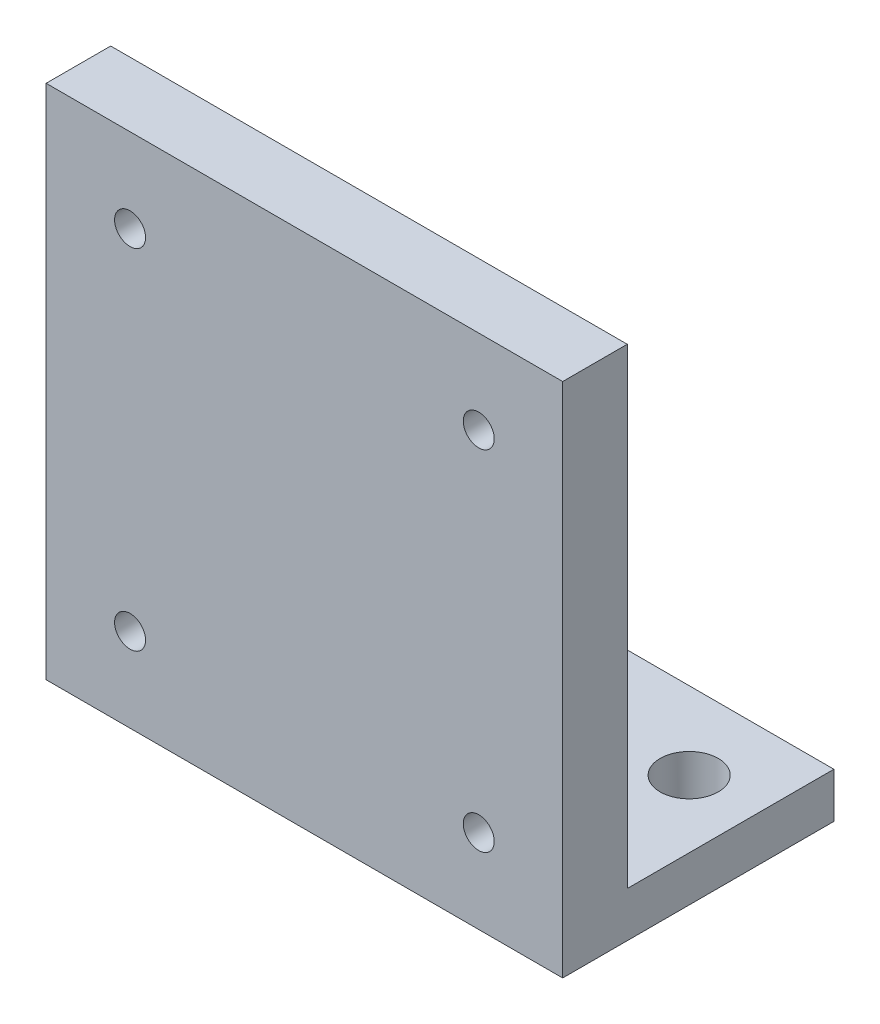
ISO-10303-21;
HEADER;
FILE_DESCRIPTION(('STEP AP214'),'2;1');
FILE_NAME('part.step','',(''),(''),'','','');
FILE_SCHEMA(('AUTOMOTIVE_DESIGN { 1 0 10303 214 1 1 1 1 }'));
ENDSEC;
DATA;
#1=APPLICATION_CONTEXT('core data for automotive mechanical design processes');
#2=APPLICATION_PROTOCOL_DEFINITION('international standard','automotive_design',2000,#1);
#3=PRODUCT_CONTEXT('',#1,'mechanical');
#4=PRODUCT('Part','Part','',(#3));
#5=PRODUCT_RELATED_PRODUCT_CATEGORY('part','',(#4));
#6=PRODUCT_DEFINITION_FORMATION('','',#4);
#7=PRODUCT_DEFINITION_CONTEXT('part definition',#1,'design');
#8=PRODUCT_DEFINITION('design','',#6,#7);
#9=PRODUCT_DEFINITION_SHAPE('','',#8);
#10=(LENGTH_UNIT() NAMED_UNIT(*) SI_UNIT(.MILLI.,.METRE.));
#11=(NAMED_UNIT(*) PLANE_ANGLE_UNIT() SI_UNIT($,.RADIAN.));
#12=(NAMED_UNIT(*) SI_UNIT($,.STERADIAN.) SOLID_ANGLE_UNIT());
#13=UNCERTAINTY_MEASURE_WITH_UNIT(LENGTH_MEASURE(1.E-05),#10,'distance_accuracy_value','');
#14=(GEOMETRIC_REPRESENTATION_CONTEXT(3) GLOBAL_UNCERTAINTY_ASSIGNED_CONTEXT((#13)) GLOBAL_UNIT_ASSIGNED_CONTEXT((#10,
#11,#12)) REPRESENTATION_CONTEXT('',''));
#15=CARTESIAN_POINT('',(0.,0.,0.));
#16=DIRECTION('',(0.,0.,1.));
#17=DIRECTION('',(1.,0.,0.));
#18=AXIS2_PLACEMENT_3D('',#15,#16,#17);
#19=CARTESIAN_POINT('',(0.,0.,0.));
#20=DIRECTION('',(0.,1.,0.));
#21=DIRECTION('',(0.,0.,1.));
#22=AXIS2_PLACEMENT_3D('',#19,#20,#21);
#23=PLANE('',#22);
#24=CARTESIAN_POINT('',(-14.7951397383474,0.,-14.));
#25=DIRECTION('',(0.,1.,0.));
#26=DIRECTION('',(0.,0.,1.));
#27=AXIS2_PLACEMENT_3D('',#24,#25,#26);
#28=CIRCLE('',#27,2.25);
#29=CARTESIAN_POINT('',(-14.7951397383474,0.,-11.75));
#30=VERTEX_POINT('',#29);
#31=EDGE_CURVE('E128',#30,#30,#28,.T.);
#32=ORIENTED_EDGE('',*,*,#31,.T.);
#33=EDGE_LOOP('',(#32));
#34=FACE_BOUND('',#33,.T.);
#35=CARTESIAN_POINT('',(14.7951397383474,0.,-14.));
#36=DIRECTION('',(0.,1.,0.));
#37=DIRECTION('',(0.,0.,1.));
#38=AXIS2_PLACEMENT_3D('',#35,#36,#37);
#39=CIRCLE('',#38,2.25);
#40=CARTESIAN_POINT('',(14.7951397383474,0.,-11.75));
#41=VERTEX_POINT('',#40);
#42=EDGE_CURVE('E125',#41,#41,#39,.T.);
#43=ORIENTED_EDGE('',*,*,#42,.T.);
#44=EDGE_LOOP('',(#43));
#45=FACE_BOUND('',#44,.T.);
#46=DIRECTION('',(0.,0.,-1.));
#47=VECTOR('',#46,1.);
#48=CARTESIAN_POINT('',(20.,0.,-20.));
#49=LINE('',#48,#47);
#50=CARTESIAN_POINT('',(20.,0.,1.));
#51=VERTEX_POINT('',#50);
#52=CARTESIAN_POINT('',(20.,0.,-20.));
#53=VERTEX_POINT('',#52);
#54=EDGE_CURVE('E142',#51,#53,#49,.T.);
#55=ORIENTED_EDGE('',*,*,#54,.F.);
#56=DIRECTION('',(-1.,0.,0.));
#57=VECTOR('',#56,1.);
#58=CARTESIAN_POINT('',(0.,0.,1.));
#59=LINE('',#58,#57);
#60=CARTESIAN_POINT('',(-20.,0.,1.));
#61=VERTEX_POINT('',#60);
#62=EDGE_CURVE('E122',#51,#61,#59,.T.);
#63=ORIENTED_EDGE('',*,*,#62,.T.);
#64=DIRECTION('',(0.,0.,1.));
#65=VECTOR('',#64,1.);
#66=CARTESIAN_POINT('',(-20.,0.,-20.));
#67=LINE('',#66,#65);
#68=CARTESIAN_POINT('',(-20.,0.,-20.));
#69=VERTEX_POINT('',#68);
#70=EDGE_CURVE('E146',#69,#61,#67,.T.);
#71=ORIENTED_EDGE('',*,*,#70,.F.);
#72=DIRECTION('',(-1.,0.,0.));
#73=VECTOR('',#72,1.);
#74=CARTESIAN_POINT('',(-20.,0.,-20.));
#75=LINE('',#74,#73);
#76=EDGE_CURVE('E144',#53,#69,#75,.T.);
#77=ORIENTED_EDGE('',*,*,#76,.F.);
#78=EDGE_LOOP('',(#55,#63,#71,#77));
#79=FACE_BOUND('',#78,.T.);
#80=ADVANCED_FACE('F35',(#34,#45,#79),#23,.F.);
#81=CARTESIAN_POINT('',(20.,5.,-20.));
#82=DIRECTION('',(-1.,0.,0.));
#83=DIRECTION('',(0.,0.,1.));
#84=AXIS2_PLACEMENT_3D('',#81,#82,#83);
#85=PLANE('',#84);
#86=DIRECTION('',(0.,0.,-1.));
#87=VECTOR('',#86,1.);
#88=CARTESIAN_POINT('',(20.,3.5,36.0281151192509));
#89=LINE('',#88,#87);
#90=CARTESIAN_POINT('',(20.,3.5,-4.));
#91=VERTEX_POINT('',#90);
#92=CARTESIAN_POINT('',(20.,3.5,-20.));
#93=VERTEX_POINT('',#92);
#94=EDGE_CURVE('E109',#91,#93,#89,.T.);
#95=ORIENTED_EDGE('',*,*,#94,.F.);
#96=DIRECTION('',(0.,-1.,0.));
#97=VECTOR('',#96,1.);
#98=CARTESIAN_POINT('',(20.,40.,-4.));
#99=LINE('',#98,#97);
#100=CARTESIAN_POINT('',(20.,40.,-4.));
#101=VERTEX_POINT('',#100);
#102=EDGE_CURVE('E99',#101,#91,#99,.T.);
#103=ORIENTED_EDGE('',*,*,#102,.F.);
#104=DIRECTION('',(0.,0.,-1.));
#105=VECTOR('',#104,1.);
#106=CARTESIAN_POINT('',(20.,40.,-4.));
#107=LINE('',#106,#105);
#108=CARTESIAN_POINT('',(20.,40.,1.));
#109=VERTEX_POINT('',#108);
#110=EDGE_CURVE('E134',#109,#101,#107,.T.);
#111=ORIENTED_EDGE('',*,*,#110,.F.);
#112=DIRECTION('',(0.,-1.,0.));
#113=VECTOR('',#112,1.);
#114=CARTESIAN_POINT('',(20.,40.,1.));
#115=LINE('',#114,#113);
#116=EDGE_CURVE('E138',#109,#51,#115,.T.);
#117=ORIENTED_EDGE('',*,*,#116,.T.);
#118=ORIENTED_EDGE('',*,*,#54,.T.);
#119=DIRECTION('',(0.,-1.,0.));
#120=VECTOR('',#119,1.);
#121=CARTESIAN_POINT('',(20.,5.,-20.));
#122=LINE('',#121,#120);
#123=EDGE_CURVE('E11',#93,#53,#122,.T.);
#124=ORIENTED_EDGE('',*,*,#123,.F.);
#125=EDGE_LOOP('',(#95,#103,#111,#117,#118,#124));
#126=FACE_BOUND('',#125,.T.);
#127=ADVANCED_FACE('F37',(#126),#85,.F.);
#128=CARTESIAN_POINT('',(-20.,5.,-20.));
#129=DIRECTION('',(0.,0.,1.));
#130=DIRECTION('',(1.,0.,0.));
#131=AXIS2_PLACEMENT_3D('',#128,#129,#130);
#132=PLANE('',#131);
#133=DIRECTION('',(0.,-1.,0.));
#134=VECTOR('',#133,1.);
#135=CARTESIAN_POINT('',(-20.,5.,-20.));
#136=LINE('',#135,#134);
#137=CARTESIAN_POINT('',(-20.,3.5,-20.));
#138=VERTEX_POINT('',#137);
#139=EDGE_CURVE('E44',#138,#69,#136,.T.);
#140=ORIENTED_EDGE('',*,*,#139,.F.);
#141=DIRECTION('',(-1.,0.,0.));
#142=VECTOR('',#141,1.);
#143=CARTESIAN_POINT('',(20.,3.5,-20.));
#144=LINE('',#143,#142);
#145=EDGE_CURVE('E108',#93,#138,#144,.T.);
#146=ORIENTED_EDGE('',*,*,#145,.F.);
#147=ORIENTED_EDGE('',*,*,#123,.T.);
#148=ORIENTED_EDGE('',*,*,#76,.T.);
#149=EDGE_LOOP('',(#140,#146,#147,#148));
#150=FACE_BOUND('',#149,.T.);
#151=ADVANCED_FACE('F184',(#150),#132,.F.);
#152=CARTESIAN_POINT('',(-20.,5.,-20.));
#153=DIRECTION('',(1.,0.,0.));
#154=DIRECTION('',(0.,0.,-1.));
#155=AXIS2_PLACEMENT_3D('',#152,#153,#154);
#156=PLANE('',#155);
#157=DIRECTION('',(0.,-1.,0.));
#158=VECTOR('',#157,1.);
#159=CARTESIAN_POINT('',(-20.,40.,-4.));
#160=LINE('',#159,#158);
#161=CARTESIAN_POINT('',(-20.,40.,-4.));
#162=VERTEX_POINT('',#161);
#163=CARTESIAN_POINT('',(-20.,3.5,-3.99999999999998));
#164=VERTEX_POINT('',#163);
#165=EDGE_CURVE('E89',#162,#164,#160,.T.);
#166=ORIENTED_EDGE('',*,*,#165,.T.);
#167=DIRECTION('',(0.,0.,-1.));
#168=VECTOR('',#167,1.);
#169=CARTESIAN_POINT('',(-20.,3.5,36.0281151192509));
#170=LINE('',#169,#168);
#171=EDGE_CURVE('E92',#164,#138,#170,.T.);
#172=ORIENTED_EDGE('',*,*,#171,.T.);
#173=ORIENTED_EDGE('',*,*,#139,.T.);
#174=ORIENTED_EDGE('',*,*,#70,.T.);
#175=DIRECTION('',(0.,-1.,0.));
#176=VECTOR('',#175,1.);
#177=CARTESIAN_POINT('',(-20.,40.,1.));
#178=LINE('',#177,#176);
#179=CARTESIAN_POINT('',(-20.,40.,1.));
#180=VERTEX_POINT('',#179);
#181=EDGE_CURVE('E140',#180,#61,#178,.T.);
#182=ORIENTED_EDGE('',*,*,#181,.F.);
#183=DIRECTION('',(0.,0.,1.));
#184=VECTOR('',#183,1.);
#185=CARTESIAN_POINT('',(-20.,40.,-4.));
#186=LINE('',#185,#184);
#187=EDGE_CURVE('E95',#162,#180,#186,.T.);
#188=ORIENTED_EDGE('',*,*,#187,.F.);
#189=EDGE_LOOP('',(#166,#172,#173,#174,#182,#188));
#190=FACE_BOUND('',#189,.T.);
#191=ADVANCED_FACE('F91',(#190),#156,.F.);
#192=CARTESIAN_POINT('',(-20.,40.,1.));
#193=DIRECTION('',(0.,0.,-1.));
#194=DIRECTION('',(-1.,0.,0.));
#195=AXIS2_PLACEMENT_3D('',#192,#193,#194);
#196=PLANE('',#195);
#197=CARTESIAN_POINT('',(13.5,33.5000000000001,1.));
#198=DIRECTION('',(0.,0.,1.));
#199=DIRECTION('',(1.,0.,0.));
#200=AXIS2_PLACEMENT_3D('',#197,#198,#199);
#201=CIRCLE('',#200,1.20000000000109);
#202=CARTESIAN_POINT('',(14.7000000000011,33.5000000000001,1.));
#203=VERTEX_POINT('',#202);
#204=EDGE_CURVE('E240',#203,#203,#201,.T.);
#205=ORIENTED_EDGE('',*,*,#204,.F.);
#206=EDGE_LOOP('',(#205));
#207=FACE_BOUND('',#206,.T.);
#208=CARTESIAN_POINT('',(-13.5,33.5000000000009,1.));
#209=DIRECTION('',(0.,0.,1.));
#210=DIRECTION('',(1.,0.,0.));
#211=AXIS2_PLACEMENT_3D('',#208,#209,#210);
#212=CIRCLE('',#211,1.20000000000041);
#213=CARTESIAN_POINT('',(-12.2999999999996,33.5000000000009,1.));
#214=VERTEX_POINT('',#213);
#215=EDGE_CURVE('E237',#214,#214,#212,.T.);
#216=ORIENTED_EDGE('',*,*,#215,.F.);
#217=EDGE_LOOP('',(#216));
#218=FACE_BOUND('',#217,.T.);
#219=CARTESIAN_POINT('',(-13.5,6.5,1.));
#220=DIRECTION('',(0.,0.,1.));
#221=DIRECTION('',(1.,0.,0.));
#222=AXIS2_PLACEMENT_3D('',#219,#220,#221);
#223=CIRCLE('',#222,1.2);
#224=CARTESIAN_POINT('',(-12.3,6.5,1.));
#225=VERTEX_POINT('',#224);
#226=EDGE_CURVE('E235',#225,#225,#223,.T.);
#227=ORIENTED_EDGE('',*,*,#226,.F.);
#228=EDGE_LOOP('',(#227));
#229=FACE_BOUND('',#228,.T.);
#230=CARTESIAN_POINT('',(13.5,6.5,1.));
#231=DIRECTION('',(0.,0.,1.));
#232=DIRECTION('',(1.,0.,0.));
#233=AXIS2_PLACEMENT_3D('',#230,#231,#232);
#234=CIRCLE('',#233,1.20000000000079);
#235=CARTESIAN_POINT('',(14.7000000000008,6.5,1.));
#236=VERTEX_POINT('',#235);
#237=EDGE_CURVE('E155',#236,#236,#234,.T.);
#238=ORIENTED_EDGE('',*,*,#237,.F.);
#239=EDGE_LOOP('',(#238));
#240=FACE_BOUND('',#239,.T.);
#241=ORIENTED_EDGE('',*,*,#181,.T.);
#242=ORIENTED_EDGE('',*,*,#62,.F.);
#243=ORIENTED_EDGE('',*,*,#116,.F.);
#244=DIRECTION('',(1.,0.,0.));
#245=VECTOR('',#244,1.);
#246=CARTESIAN_POINT('',(-20.,40.,1.));
#247=LINE('',#246,#245);
#248=EDGE_CURVE('E132',#180,#109,#247,.T.);
#249=ORIENTED_EDGE('',*,*,#248,.F.);
#250=EDGE_LOOP('',(#241,#242,#243,#249));
#251=FACE_BOUND('',#250,.T.);
#252=ADVANCED_FACE('F189',(#207,#218,#229,#240,#251),#196,.F.);
#253=CARTESIAN_POINT('',(-20.,40.,-4.));
#254=DIRECTION('',(0.,0.,1.));
#255=DIRECTION('',(1.,0.,0.));
#256=AXIS2_PLACEMENT_3D('',#253,#254,#255);
#257=PLANE('',#256);
#258=CARTESIAN_POINT('',(13.5,33.5000000000001,-4.));
#259=DIRECTION('',(0.,0.,1.));
#260=DIRECTION('',(1.,0.,0.));
#261=AXIS2_PLACEMENT_3D('',#258,#259,#260);
#262=CIRCLE('',#261,1.20000000000109);
#263=CARTESIAN_POINT('',(14.7000000000011,33.5000000000001,-4.));
#264=VERTEX_POINT('',#263);
#265=EDGE_CURVE('E39',#264,#264,#262,.T.);
#266=ORIENTED_EDGE('',*,*,#265,.T.);
#267=EDGE_LOOP('',(#266));
#268=FACE_BOUND('',#267,.T.);
#269=CARTESIAN_POINT('',(-13.5,33.5000000000009,-4.));
#270=DIRECTION('',(0.,0.,1.));
#271=DIRECTION('',(1.,0.,0.));
#272=AXIS2_PLACEMENT_3D('',#269,#270,#271);
#273=CIRCLE('',#272,1.20000000000041);
#274=CARTESIAN_POINT('',(-12.2999999999996,33.5000000000009,-4.));
#275=VERTEX_POINT('',#274);
#276=EDGE_CURVE('E157',#275,#275,#273,.T.);
#277=ORIENTED_EDGE('',*,*,#276,.T.);
#278=EDGE_LOOP('',(#277));
#279=FACE_BOUND('',#278,.T.);
#280=CARTESIAN_POINT('',(-13.5,6.5,-4.));
#281=DIRECTION('',(0.,0.,1.));
#282=DIRECTION('',(1.,0.,0.));
#283=AXIS2_PLACEMENT_3D('',#280,#281,#282);
#284=CIRCLE('',#283,1.2);
#285=CARTESIAN_POINT('',(-12.3,6.5,-4.));
#286=VERTEX_POINT('',#285);
#287=EDGE_CURVE('E154',#286,#286,#284,.T.);
#288=ORIENTED_EDGE('',*,*,#287,.T.);
#289=EDGE_LOOP('',(#288));
#290=FACE_BOUND('',#289,.T.);
#291=CARTESIAN_POINT('',(13.5,6.5,-4.));
#292=DIRECTION('',(0.,0.,1.));
#293=DIRECTION('',(1.,0.,0.));
#294=AXIS2_PLACEMENT_3D('',#291,#292,#293);
#295=CIRCLE('',#294,1.20000000000079);
#296=CARTESIAN_POINT('',(14.7000000000008,6.5,-4.));
#297=VERTEX_POINT('',#296);
#298=EDGE_CURVE('E151',#297,#297,#295,.T.);
#299=ORIENTED_EDGE('',*,*,#298,.T.);
#300=EDGE_LOOP('',(#299));
#301=FACE_BOUND('',#300,.T.);
#302=ORIENTED_EDGE('',*,*,#102,.T.);
#303=DIRECTION('',(-1.,0.,0.));
#304=VECTOR('',#303,1.);
#305=CARTESIAN_POINT('',(20.,3.5,-4.));
#306=LINE('',#305,#304);
#307=EDGE_CURVE('E106',#91,#164,#306,.T.);
#308=ORIENTED_EDGE('',*,*,#307,.T.);
#309=ORIENTED_EDGE('',*,*,#165,.F.);
#310=DIRECTION('',(-1.,0.,0.));
#311=VECTOR('',#310,1.);
#312=CARTESIAN_POINT('',(-20.,40.,-4.));
#313=LINE('',#312,#311);
#314=EDGE_CURVE('E100',#101,#162,#313,.T.);
#315=ORIENTED_EDGE('',*,*,#314,.F.);
#316=EDGE_LOOP('',(#302,#308,#309,#315));
#317=FACE_BOUND('',#316,.T.);
#318=ADVANCED_FACE('F111',(#268,#279,#290,#301,#317),#257,.F.);
#319=CARTESIAN_POINT('',(0.,40.,0.));
#320=DIRECTION('',(0.,1.,0.));
#321=DIRECTION('',(0.,0.,1.));
#322=AXIS2_PLACEMENT_3D('',#319,#320,#321);
#323=PLANE('',#322);
#324=ORIENTED_EDGE('',*,*,#187,.T.);
#325=ORIENTED_EDGE('',*,*,#248,.T.);
#326=ORIENTED_EDGE('',*,*,#110,.T.);
#327=ORIENTED_EDGE('',*,*,#314,.T.);
#328=EDGE_LOOP('',(#324,#325,#326,#327));
#329=FACE_BOUND('',#328,.T.);
#330=ADVANCED_FACE('F204',(#329),#323,.T.);
#331=CARTESIAN_POINT('',(14.7951397383474,-15.,-14.));
#332=DIRECTION('',(0.,1.,0.));
#333=DIRECTION('',(0.,0.,1.));
#334=AXIS2_PLACEMENT_3D('',#331,#332,#333);
#335=CYLINDRICAL_SURFACE('',#334,2.25);
#336=CARTESIAN_POINT('',(14.7951397383474,3.5,-14.));
#337=DIRECTION('',(0.,-1.,0.));
#338=DIRECTION('',(0.,0.,-1.));
#339=AXIS2_PLACEMENT_3D('',#336,#337,#338);
#340=CIRCLE('',#339,2.25);
#341=CARTESIAN_POINT('',(14.7951397383474,3.5,-16.25));
#342=VERTEX_POINT('',#341);
#343=EDGE_CURVE('E119',#342,#342,#340,.F.);
#344=ORIENTED_EDGE('',*,*,#343,.T.);
#345=EDGE_LOOP('',(#344));
#346=FACE_BOUND('',#345,.T.);
#347=ORIENTED_EDGE('',*,*,#42,.F.);
#348=EDGE_LOOP('',(#347));
#349=FACE_BOUND('',#348,.T.);
#350=ADVANCED_FACE('F206',(#346,#349),#335,.F.);
#351=CARTESIAN_POINT('',(-14.7951397383474,-15.,-14.));
#352=DIRECTION('',(0.,1.,0.));
#353=DIRECTION('',(0.,0.,1.));
#354=AXIS2_PLACEMENT_3D('',#351,#352,#353);
#355=CYLINDRICAL_SURFACE('',#354,2.25);
#356=CARTESIAN_POINT('',(-14.7951397383474,3.5,-14.));
#357=DIRECTION('',(0.,-1.,0.));
#358=DIRECTION('',(0.,0.,-1.));
#359=AXIS2_PLACEMENT_3D('',#356,#357,#358);
#360=CIRCLE('',#359,2.25);
#361=CARTESIAN_POINT('',(-14.7951397383474,3.5,-16.25));
#362=VERTEX_POINT('',#361);
#363=EDGE_CURVE('E118',#362,#362,#360,.F.);
#364=ORIENTED_EDGE('',*,*,#363,.T.);
#365=EDGE_LOOP('',(#364));
#366=FACE_BOUND('',#365,.T.);
#367=ORIENTED_EDGE('',*,*,#31,.F.);
#368=EDGE_LOOP('',(#367));
#369=FACE_BOUND('',#368,.T.);
#370=ADVANCED_FACE('F212',(#366,#369),#355,.F.);
#371=CARTESIAN_POINT('',(20.,3.5,36.0281151192509));
#372=DIRECTION('',(0.,-1.,0.));
#373=DIRECTION('',(0.,0.,-1.));
#374=AXIS2_PLACEMENT_3D('',#371,#372,#373);
#375=PLANE('',#374);
#376=ORIENTED_EDGE('',*,*,#363,.F.);
#377=EDGE_LOOP('',(#376));
#378=FACE_BOUND('',#377,.T.);
#379=ORIENTED_EDGE('',*,*,#94,.T.);
#380=ORIENTED_EDGE('',*,*,#145,.T.);
#381=ORIENTED_EDGE('',*,*,#171,.F.);
#382=ORIENTED_EDGE('',*,*,#307,.F.);
#383=EDGE_LOOP('',(#379,#380,#381,#382));
#384=FACE_BOUND('',#383,.T.);
#385=ORIENTED_EDGE('',*,*,#343,.F.);
#386=EDGE_LOOP('',(#385));
#387=FACE_BOUND('',#386,.T.);
#388=ADVANCED_FACE('F104',(#378,#384,#387),#375,.F.);
#389=CARTESIAN_POINT('',(13.5,6.5,-19.));
#390=DIRECTION('',(0.,0.,1.));
#391=DIRECTION('',(1.,0.,0.));
#392=AXIS2_PLACEMENT_3D('',#389,#390,#391);
#393=CYLINDRICAL_SURFACE('',#392,1.20000000000079);
#394=ORIENTED_EDGE('',*,*,#237,.T.);
#395=EDGE_LOOP('',(#394));
#396=FACE_BOUND('',#395,.T.);
#397=ORIENTED_EDGE('',*,*,#298,.F.);
#398=EDGE_LOOP('',(#397));
#399=FACE_BOUND('',#398,.T.);
#400=ADVANCED_FACE('F220',(#396,#399),#393,.F.);
#401=CARTESIAN_POINT('',(-13.5,6.5,-19.));
#402=DIRECTION('',(0.,0.,1.));
#403=DIRECTION('',(1.,0.,0.));
#404=AXIS2_PLACEMENT_3D('',#401,#402,#403);
#405=CYLINDRICAL_SURFACE('',#404,1.2);
#406=ORIENTED_EDGE('',*,*,#226,.T.);
#407=EDGE_LOOP('',(#406));
#408=FACE_BOUND('',#407,.T.);
#409=ORIENTED_EDGE('',*,*,#287,.F.);
#410=EDGE_LOOP('',(#409));
#411=FACE_BOUND('',#410,.T.);
#412=ADVANCED_FACE('F173',(#408,#411),#405,.F.);
#413=CARTESIAN_POINT('',(-13.5,33.5000000000009,-19.));
#414=DIRECTION('',(0.,0.,1.));
#415=DIRECTION('',(1.,0.,0.));
#416=AXIS2_PLACEMENT_3D('',#413,#414,#415);
#417=CYLINDRICAL_SURFACE('',#416,1.20000000000041);
#418=ORIENTED_EDGE('',*,*,#215,.T.);
#419=EDGE_LOOP('',(#418));
#420=FACE_BOUND('',#419,.T.);
#421=ORIENTED_EDGE('',*,*,#276,.F.);
#422=EDGE_LOOP('',(#421));
#423=FACE_BOUND('',#422,.T.);
#424=ADVANCED_FACE('F167',(#420,#423),#417,.F.);
#425=CARTESIAN_POINT('',(13.5,33.5000000000001,-19.));
#426=DIRECTION('',(0.,0.,1.));
#427=DIRECTION('',(1.,0.,0.));
#428=AXIS2_PLACEMENT_3D('',#425,#426,#427);
#429=CYLINDRICAL_SURFACE('',#428,1.20000000000109);
#430=ORIENTED_EDGE('',*,*,#204,.T.);
#431=EDGE_LOOP('',(#430));
#432=FACE_BOUND('',#431,.T.);
#433=ORIENTED_EDGE('',*,*,#265,.F.);
#434=EDGE_LOOP('',(#433));
#435=FACE_BOUND('',#434,.T.);
#436=ADVANCED_FACE('F165',(#432,#435),#429,.F.);
#437=CLOSED_SHELL('',(#80,#127,#151,#191,#252,#318,#330,#350,#370,#388,#400,#412,#424,#436));
#438=MANIFOLD_SOLID_BREP('B2',#437);
#439=ADVANCED_BREP_SHAPE_REPRESENTATION('',(#18,#438),#14);
#440=SHAPE_DEFINITION_REPRESENTATION(#9,#439);
ENDSEC;
END-ISO-10303-21;
